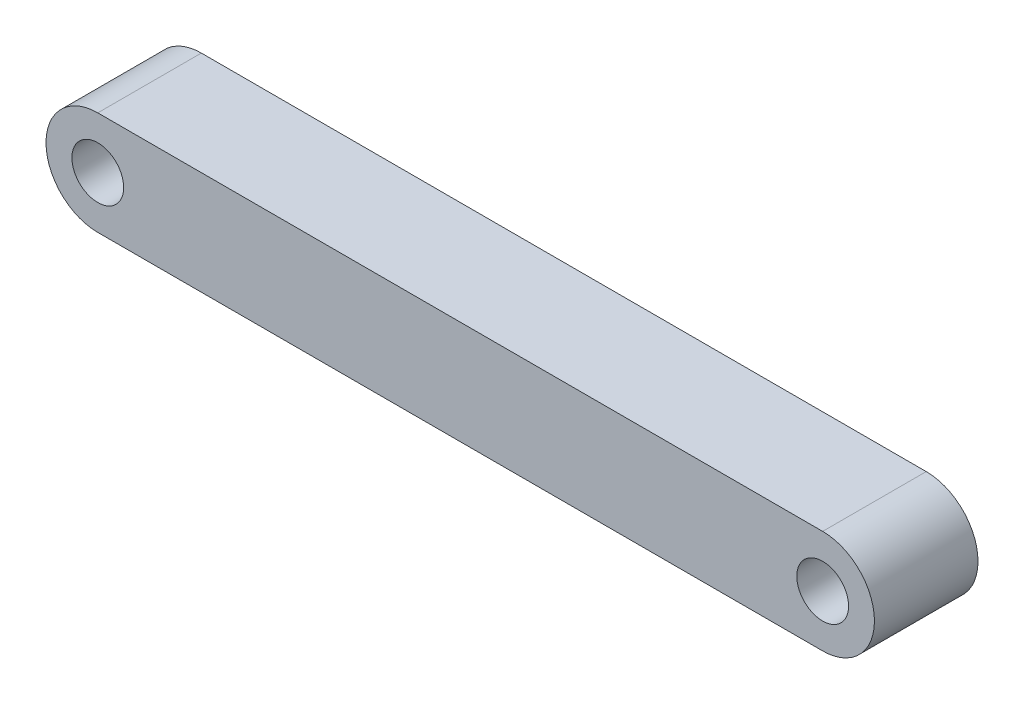
ISO-10303-21;
HEADER;
FILE_DESCRIPTION(('STEP AP214'),'2;1');
FILE_NAME('part.step','',(''),(''),'','','');
FILE_SCHEMA(('AUTOMOTIVE_DESIGN { 1 0 10303 214 1 1 1 1 }'));
ENDSEC;
DATA;
#1=APPLICATION_CONTEXT('core data for automotive mechanical design processes');
#2=APPLICATION_PROTOCOL_DEFINITION('international standard','automotive_design',2000,#1);
#3=PRODUCT_CONTEXT('',#1,'mechanical');
#4=PRODUCT('Part','Part','',(#3));
#5=PRODUCT_RELATED_PRODUCT_CATEGORY('part','',(#4));
#6=PRODUCT_DEFINITION_FORMATION('','',#4);
#7=PRODUCT_DEFINITION_CONTEXT('part definition',#1,'design');
#8=PRODUCT_DEFINITION('design','',#6,#7);
#9=PRODUCT_DEFINITION_SHAPE('','',#8);
#10=(LENGTH_UNIT() NAMED_UNIT(*) SI_UNIT(.MILLI.,.METRE.));
#11=(NAMED_UNIT(*) PLANE_ANGLE_UNIT() SI_UNIT($,.RADIAN.));
#12=(NAMED_UNIT(*) SI_UNIT($,.STERADIAN.) SOLID_ANGLE_UNIT());
#13=UNCERTAINTY_MEASURE_WITH_UNIT(LENGTH_MEASURE(1.E-05),#10,'distance_accuracy_value','');
#14=(GEOMETRIC_REPRESENTATION_CONTEXT(3) GLOBAL_UNCERTAINTY_ASSIGNED_CONTEXT((#13)) GLOBAL_UNIT_ASSIGNED_CONTEXT((#10,
#11,#12)) REPRESENTATION_CONTEXT('',''));
#15=CARTESIAN_POINT('',(0.,0.,0.));
#16=DIRECTION('',(0.,0.,1.));
#17=DIRECTION('',(1.,0.,0.));
#18=AXIS2_PLACEMENT_3D('',#15,#16,#17);
#19=CARTESIAN_POINT('',(0.,3.,6.));
#20=DIRECTION('',(0.,0.,1.));
#21=DIRECTION('',(1.,0.,0.));
#22=AXIS2_PLACEMENT_3D('',#19,#20,#21);
#23=PLANE('',#22);
#24=CARTESIAN_POINT('',(0.,3.,6.));
#25=DIRECTION('',(0.,0.,1.));
#26=DIRECTION('',(1.,0.,0.));
#27=AXIS2_PLACEMENT_3D('',#24,#25,#26);
#28=CIRCLE('',#27,1.5);
#29=CARTESIAN_POINT('',(1.5,3.,6.));
#30=VERTEX_POINT('',#29);
#31=EDGE_CURVE('E99',#30,#30,#28,.T.);
#32=ORIENTED_EDGE('',*,*,#31,.F.);
#33=EDGE_LOOP('',(#32));
#34=FACE_BOUND('',#33,.T.);
#35=CARTESIAN_POINT('',(0.,3.,6.));
#36=DIRECTION('',(0.,0.,1.));
#37=DIRECTION('',(1.,0.,0.));
#38=AXIS2_PLACEMENT_3D('',#35,#36,#37);
#39=CIRCLE('',#38,3.);
#40=CARTESIAN_POINT('',(0.,6.,6.));
#41=VERTEX_POINT('',#40);
#42=CARTESIAN_POINT('',(0.,0.,6.));
#43=VERTEX_POINT('',#42);
#44=EDGE_CURVE('E84',#41,#43,#39,.T.);
#45=ORIENTED_EDGE('',*,*,#44,.T.);
#46=DIRECTION('',(1.,0.,0.));
#47=VECTOR('',#46,1.);
#48=CARTESIAN_POINT('',(0.,0.,6.));
#49=LINE('',#48,#47);
#50=CARTESIAN_POINT('',(42.,0.,6.));
#51=VERTEX_POINT('',#50);
#52=EDGE_CURVE('E79',#43,#51,#49,.T.);
#53=ORIENTED_EDGE('',*,*,#52,.T.);
#54=CARTESIAN_POINT('',(42.,3.,6.));
#55=DIRECTION('',(0.,0.,1.));
#56=DIRECTION('',(1.,0.,0.));
#57=AXIS2_PLACEMENT_3D('',#54,#55,#56);
#58=CIRCLE('',#57,3.);
#59=CARTESIAN_POINT('',(42.,6.,6.));
#60=VERTEX_POINT('',#59);
#61=EDGE_CURVE('E82',#51,#60,#58,.T.);
#62=ORIENTED_EDGE('',*,*,#61,.T.);
#63=DIRECTION('',(-1.,0.,0.));
#64=VECTOR('',#63,1.);
#65=CARTESIAN_POINT('',(0.,6.,6.));
#66=LINE('',#65,#64);
#67=EDGE_CURVE('E49',#60,#41,#66,.T.);
#68=ORIENTED_EDGE('',*,*,#67,.T.);
#69=EDGE_LOOP('',(#45,#53,#62,#68));
#70=FACE_BOUND('',#69,.T.);
#71=CARTESIAN_POINT('',(42.,3.,6.));
#72=DIRECTION('',(0.,0.,1.));
#73=DIRECTION('',(1.,0.,0.));
#74=AXIS2_PLACEMENT_3D('',#71,#72,#73);
#75=CIRCLE('',#74,1.5);
#76=CARTESIAN_POINT('',(43.5,3.,6.));
#77=VERTEX_POINT('',#76);
#78=EDGE_CURVE('E114',#77,#77,#75,.T.);
#79=ORIENTED_EDGE('',*,*,#78,.F.);
#80=EDGE_LOOP('',(#79));
#81=FACE_BOUND('',#80,.T.);
#82=ADVANCED_FACE('F32',(#34,#70,#81),#23,.T.);
#83=CARTESIAN_POINT('',(0.,3.,0.));
#84=DIRECTION('',(0.,0.,1.));
#85=DIRECTION('',(1.,0.,0.));
#86=AXIS2_PLACEMENT_3D('',#83,#84,#85);
#87=PLANE('',#86);
#88=CARTESIAN_POINT('',(0.,3.,0.));
#89=DIRECTION('',(0.,0.,1.));
#90=DIRECTION('',(1.,0.,0.));
#91=AXIS2_PLACEMENT_3D('',#88,#89,#90);
#92=CIRCLE('',#91,3.);
#93=CARTESIAN_POINT('',(0.,6.,0.));
#94=VERTEX_POINT('',#93);
#95=CARTESIAN_POINT('',(0.,0.,0.));
#96=VERTEX_POINT('',#95);
#97=EDGE_CURVE('E96',#94,#96,#92,.T.);
#98=ORIENTED_EDGE('',*,*,#97,.F.);
#99=DIRECTION('',(-1.,0.,0.));
#100=VECTOR('',#99,1.);
#101=CARTESIAN_POINT('',(0.,6.,0.));
#102=LINE('',#101,#100);
#103=CARTESIAN_POINT('',(42.,6.,0.));
#104=VERTEX_POINT('',#103);
#105=EDGE_CURVE('E72',#104,#94,#102,.T.);
#106=ORIENTED_EDGE('',*,*,#105,.F.);
#107=CARTESIAN_POINT('',(42.,3.,0.));
#108=DIRECTION('',(0.,0.,1.));
#109=DIRECTION('',(1.,0.,0.));
#110=AXIS2_PLACEMENT_3D('',#107,#108,#109);
#111=CIRCLE('',#110,3.);
#112=CARTESIAN_POINT('',(42.,0.,0.));
#113=VERTEX_POINT('',#112);
#114=EDGE_CURVE('E66',#113,#104,#111,.T.);
#115=ORIENTED_EDGE('',*,*,#114,.F.);
#116=DIRECTION('',(1.,0.,0.));
#117=VECTOR('',#116,1.);
#118=CARTESIAN_POINT('',(0.,0.,0.));
#119=LINE('',#118,#117);
#120=EDGE_CURVE('E88',#96,#113,#119,.T.);
#121=ORIENTED_EDGE('',*,*,#120,.F.);
#122=EDGE_LOOP('',(#98,#106,#115,#121));
#123=FACE_BOUND('',#122,.T.);
#124=CARTESIAN_POINT('',(0.,3.,0.));
#125=DIRECTION('',(0.,0.,1.));
#126=DIRECTION('',(1.,0.,0.));
#127=AXIS2_PLACEMENT_3D('',#124,#125,#126);
#128=CIRCLE('',#127,1.5);
#129=CARTESIAN_POINT('',(1.5,3.,0.));
#130=VERTEX_POINT('',#129);
#131=EDGE_CURVE('E111',#130,#130,#128,.T.);
#132=ORIENTED_EDGE('',*,*,#131,.T.);
#133=EDGE_LOOP('',(#132));
#134=FACE_BOUND('',#133,.T.);
#135=CARTESIAN_POINT('',(42.,3.,0.));
#136=DIRECTION('',(0.,0.,1.));
#137=DIRECTION('',(1.,0.,0.));
#138=AXIS2_PLACEMENT_3D('',#135,#136,#137);
#139=CIRCLE('',#138,1.5);
#140=CARTESIAN_POINT('',(43.5,3.,0.));
#141=VERTEX_POINT('',#140);
#142=EDGE_CURVE('E117',#141,#141,#139,.T.);
#143=ORIENTED_EDGE('',*,*,#142,.T.);
#144=EDGE_LOOP('',(#143));
#145=FACE_BOUND('',#144,.T.);
#146=ADVANCED_FACE('F107',(#123,#134,#145),#87,.F.);
#147=CARTESIAN_POINT('',(0.,3.,6.));
#148=DIRECTION('',(0.,0.,-1.));
#149=DIRECTION('',(-1.,0.,0.));
#150=AXIS2_PLACEMENT_3D('',#147,#148,#149);
#151=CYLINDRICAL_SURFACE('',#150,3.);
#152=ORIENTED_EDGE('',*,*,#97,.T.);
#153=DIRECTION('',(0.,0.,-1.));
#154=VECTOR('',#153,1.);
#155=CARTESIAN_POINT('',(0.,0.,6.));
#156=LINE('',#155,#154);
#157=EDGE_CURVE('E11',#43,#96,#156,.T.);
#158=ORIENTED_EDGE('',*,*,#157,.F.);
#159=ORIENTED_EDGE('',*,*,#44,.F.);
#160=DIRECTION('',(0.,0.,-1.));
#161=VECTOR('',#160,1.);
#162=CARTESIAN_POINT('',(0.,6.,6.));
#163=LINE('',#162,#161);
#164=EDGE_CURVE('E92',#41,#94,#163,.T.);
#165=ORIENTED_EDGE('',*,*,#164,.T.);
#166=EDGE_LOOP('',(#152,#158,#159,#165));
#167=FACE_BOUND('',#166,.T.);
#168=ADVANCED_FACE('F34',(#167),#151,.T.);
#169=CARTESIAN_POINT('',(0.,0.,6.));
#170=DIRECTION('',(0.,1.,0.));
#171=DIRECTION('',(0.,0.,1.));
#172=AXIS2_PLACEMENT_3D('',#169,#170,#171);
#173=PLANE('',#172);
#174=ORIENTED_EDGE('',*,*,#120,.T.);
#175=DIRECTION('',(0.,0.,-1.));
#176=VECTOR('',#175,1.);
#177=CARTESIAN_POINT('',(42.,0.,6.));
#178=LINE('',#177,#176);
#179=EDGE_CURVE('E41',#51,#113,#178,.T.);
#180=ORIENTED_EDGE('',*,*,#179,.F.);
#181=ORIENTED_EDGE('',*,*,#52,.F.);
#182=ORIENTED_EDGE('',*,*,#157,.T.);
#183=EDGE_LOOP('',(#174,#180,#181,#182));
#184=FACE_BOUND('',#183,.T.);
#185=ADVANCED_FACE('F87',(#184),#173,.F.);
#186=CARTESIAN_POINT('',(42.,3.,6.));
#187=DIRECTION('',(0.,0.,-1.));
#188=DIRECTION('',(-1.,0.,0.));
#189=AXIS2_PLACEMENT_3D('',#186,#187,#188);
#190=CYLINDRICAL_SURFACE('',#189,3.);
#191=ORIENTED_EDGE('',*,*,#114,.T.);
#192=DIRECTION('',(0.,0.,-1.));
#193=VECTOR('',#192,1.);
#194=CARTESIAN_POINT('',(42.,6.,6.));
#195=LINE('',#194,#193);
#196=EDGE_CURVE('E89',#60,#104,#195,.T.);
#197=ORIENTED_EDGE('',*,*,#196,.F.);
#198=ORIENTED_EDGE('',*,*,#61,.F.);
#199=ORIENTED_EDGE('',*,*,#179,.T.);
#200=EDGE_LOOP('',(#191,#197,#198,#199));
#201=FACE_BOUND('',#200,.T.);
#202=ADVANCED_FACE('F90',(#201),#190,.T.);
#203=CARTESIAN_POINT('',(0.,6.,6.));
#204=DIRECTION('',(0.,-1.,0.));
#205=DIRECTION('',(0.,0.,-1.));
#206=AXIS2_PLACEMENT_3D('',#203,#204,#205);
#207=PLANE('',#206);
#208=ORIENTED_EDGE('',*,*,#105,.T.);
#209=ORIENTED_EDGE('',*,*,#164,.F.);
#210=ORIENTED_EDGE('',*,*,#67,.F.);
#211=ORIENTED_EDGE('',*,*,#196,.T.);
#212=EDGE_LOOP('',(#208,#209,#210,#211));
#213=FACE_BOUND('',#212,.T.);
#214=ADVANCED_FACE('F104',(#213),#207,.F.);
#215=CARTESIAN_POINT('',(0.,3.,6.));
#216=DIRECTION('',(0.,0.,-1.));
#217=DIRECTION('',(-1.,0.,0.));
#218=AXIS2_PLACEMENT_3D('',#215,#216,#217);
#219=CYLINDRICAL_SURFACE('',#218,1.5);
#220=ORIENTED_EDGE('',*,*,#31,.T.);
#221=EDGE_LOOP('',(#220));
#222=FACE_BOUND('',#221,.T.);
#223=ORIENTED_EDGE('',*,*,#131,.F.);
#224=EDGE_LOOP('',(#223));
#225=FACE_BOUND('',#224,.T.);
#226=ADVANCED_FACE('F134',(#222,#225),#219,.F.);
#227=CARTESIAN_POINT('',(42.,3.,6.));
#228=DIRECTION('',(0.,0.,-1.));
#229=DIRECTION('',(-1.,0.,0.));
#230=AXIS2_PLACEMENT_3D('',#227,#228,#229);
#231=CYLINDRICAL_SURFACE('',#230,1.5);
#232=ORIENTED_EDGE('',*,*,#78,.T.);
#233=EDGE_LOOP('',(#232));
#234=FACE_BOUND('',#233,.T.);
#235=ORIENTED_EDGE('',*,*,#142,.F.);
#236=EDGE_LOOP('',(#235));
#237=FACE_BOUND('',#236,.T.);
#238=ADVANCED_FACE('F123',(#234,#237),#231,.F.);
#239=CLOSED_SHELL('',(#82,#146,#168,#185,#202,#214,#226,#238));
#240=MANIFOLD_SOLID_BREP('B2',#239);
#241=ADVANCED_BREP_SHAPE_REPRESENTATION('',(#18,#240),#14);
#242=SHAPE_DEFINITION_REPRESENTATION(#9,#241);
ENDSEC;
END-ISO-10303-21;
